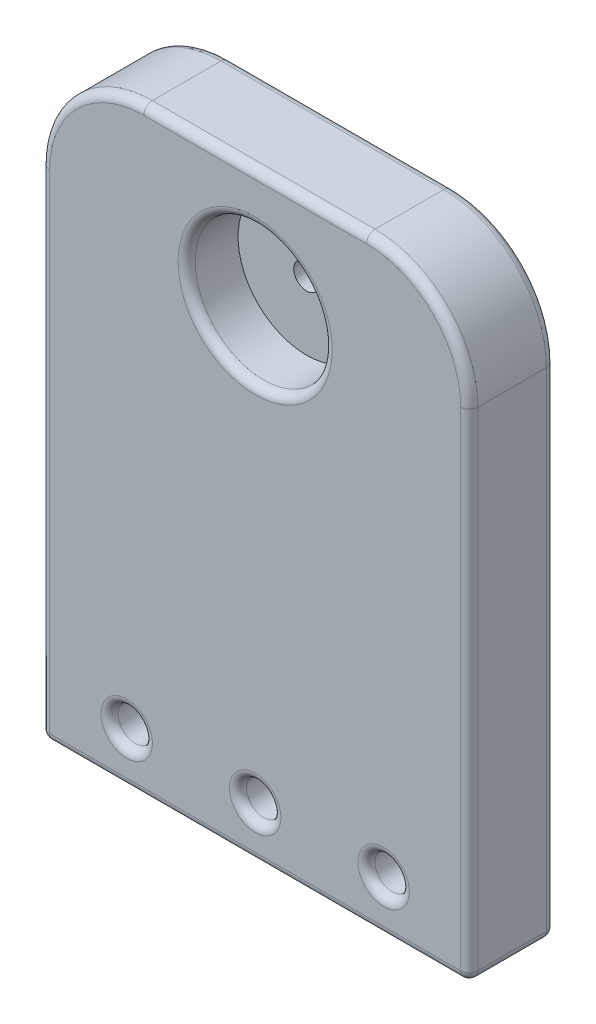
ISO-10303-21;
HEADER;
FILE_DESCRIPTION(('STEP AP214'),'2;1');
FILE_NAME('part.step','',(''),(''),'','','');
FILE_SCHEMA(('AUTOMOTIVE_DESIGN { 1 0 10303 214 1 1 1 1 }'));
ENDSEC;
DATA;
#1=APPLICATION_CONTEXT('core data for automotive mechanical design processes');
#2=APPLICATION_PROTOCOL_DEFINITION('international standard','automotive_design',2000,#1);
#3=PRODUCT_CONTEXT('',#1,'mechanical');
#4=PRODUCT('Part','Part','',(#3));
#5=PRODUCT_RELATED_PRODUCT_CATEGORY('part','',(#4));
#6=PRODUCT_DEFINITION_FORMATION('','',#4);
#7=PRODUCT_DEFINITION_CONTEXT('part definition',#1,'design');
#8=PRODUCT_DEFINITION('design','',#6,#7);
#9=PRODUCT_DEFINITION_SHAPE('','',#8);
#10=(LENGTH_UNIT() NAMED_UNIT(*) SI_UNIT(.MILLI.,.METRE.));
#11=(NAMED_UNIT(*) PLANE_ANGLE_UNIT() SI_UNIT($,.RADIAN.));
#12=(NAMED_UNIT(*) SI_UNIT($,.STERADIAN.) SOLID_ANGLE_UNIT());
#13=UNCERTAINTY_MEASURE_WITH_UNIT(LENGTH_MEASURE(1.E-05),#10,'distance_accuracy_value','');
#14=(GEOMETRIC_REPRESENTATION_CONTEXT(3) GLOBAL_UNCERTAINTY_ASSIGNED_CONTEXT((#13)) GLOBAL_UNIT_ASSIGNED_CONTEXT((#10,
#11,#12)) REPRESENTATION_CONTEXT('',''));
#15=CARTESIAN_POINT('',(0.,0.,0.));
#16=DIRECTION('',(0.,0.,1.));
#17=DIRECTION('',(1.,0.,0.));
#18=AXIS2_PLACEMENT_3D('',#15,#16,#17);
#19=CARTESIAN_POINT('',(-15.,-29.,14.));
#20=DIRECTION('',(0.,0.,-1.));
#21=DIRECTION('',(-1.,0.,0.));
#22=AXIS2_PLACEMENT_3D('',#19,#20,#21);
#23=CYLINDRICAL_SURFACE('',#22,2.);
#24=CARTESIAN_POINT('',(-15.,-29.,9.));
#25=DIRECTION('',(0.,0.,-1.));
#26=DIRECTION('',(-1.,0.,0.));
#27=AXIS2_PLACEMENT_3D('',#24,#25,#26);
#28=CIRCLE('',#27,2.);
#29=CARTESIAN_POINT('',(-17.,-29.,9.));
#30=VERTEX_POINT('',#29);
#31=EDGE_CURVE('E366',#30,#30,#28,.F.);
#32=ORIENTED_EDGE('',*,*,#31,.T.);
#33=EDGE_LOOP('',(#32));
#34=FACE_BOUND('',#33,.T.);
#35=CARTESIAN_POINT('',(-15.,-29.,4.));
#36=DIRECTION('',(0.,0.,-1.));
#37=DIRECTION('',(-1.,0.,0.));
#38=AXIS2_PLACEMENT_3D('',#35,#36,#37);
#39=CIRCLE('',#38,2.);
#40=CARTESIAN_POINT('',(-17.,-29.,4.));
#41=VERTEX_POINT('',#40);
#42=EDGE_CURVE('E263',#41,#41,#39,.F.);
#43=ORIENTED_EDGE('',*,*,#42,.F.);
#44=EDGE_LOOP('',(#43));
#45=FACE_BOUND('',#44,.T.);
#46=ADVANCED_FACE('F44',(#34,#45),#23,.F.);
#47=CARTESIAN_POINT('',(0.,-29.,14.));
#48=DIRECTION('',(0.,0.,-1.));
#49=DIRECTION('',(-1.,0.,0.));
#50=AXIS2_PLACEMENT_3D('',#47,#48,#49);
#51=CYLINDRICAL_SURFACE('',#50,2.);
#52=CARTESIAN_POINT('',(0.,-29.,9.));
#53=DIRECTION('',(0.,0.,-1.));
#54=DIRECTION('',(-1.,0.,0.));
#55=AXIS2_PLACEMENT_3D('',#52,#53,#54);
#56=CIRCLE('',#55,2.);
#57=CARTESIAN_POINT('',(-2.,-29.,9.));
#58=VERTEX_POINT('',#57);
#59=EDGE_CURVE('E370',#58,#58,#56,.F.);
#60=ORIENTED_EDGE('',*,*,#59,.T.);
#61=EDGE_LOOP('',(#60));
#62=FACE_BOUND('',#61,.T.);
#63=CARTESIAN_POINT('',(0.,-29.,4.));
#64=DIRECTION('',(0.,0.,-1.));
#65=DIRECTION('',(-1.,0.,0.));
#66=AXIS2_PLACEMENT_3D('',#63,#64,#65);
#67=CIRCLE('',#66,2.);
#68=CARTESIAN_POINT('',(-2.,-29.,4.));
#69=VERTEX_POINT('',#68);
#70=EDGE_CURVE('E280',#69,#69,#67,.F.);
#71=ORIENTED_EDGE('',*,*,#70,.F.);
#72=EDGE_LOOP('',(#71));
#73=FACE_BOUND('',#72,.T.);
#74=ADVANCED_FACE('F524',(#62,#73),#51,.F.);
#75=CARTESIAN_POINT('',(15.,-29.,14.));
#76=DIRECTION('',(0.,0.,-1.));
#77=DIRECTION('',(-1.,0.,0.));
#78=AXIS2_PLACEMENT_3D('',#75,#76,#77);
#79=CYLINDRICAL_SURFACE('',#78,2.);
#80=CARTESIAN_POINT('',(15.,-29.,9.));
#81=DIRECTION('',(0.,0.,-1.));
#82=DIRECTION('',(-1.,0.,0.));
#83=AXIS2_PLACEMENT_3D('',#80,#81,#82);
#84=CIRCLE('',#83,2.);
#85=CARTESIAN_POINT('',(13.,-29.,9.));
#86=VERTEX_POINT('',#85);
#87=EDGE_CURVE('E374',#86,#86,#84,.F.);
#88=ORIENTED_EDGE('',*,*,#87,.T.);
#89=EDGE_LOOP('',(#88));
#90=FACE_BOUND('',#89,.T.);
#91=CARTESIAN_POINT('',(15.,-29.,4.));
#92=DIRECTION('',(0.,0.,-1.));
#93=DIRECTION('',(-1.,0.,0.));
#94=AXIS2_PLACEMENT_3D('',#91,#92,#93);
#95=CIRCLE('',#94,2.);
#96=CARTESIAN_POINT('',(13.,-29.,4.));
#97=VERTEX_POINT('',#96);
#98=EDGE_CURVE('E276',#97,#97,#95,.F.);
#99=ORIENTED_EDGE('',*,*,#98,.F.);
#100=EDGE_LOOP('',(#99));
#101=FACE_BOUND('',#100,.T.);
#102=ADVANCED_FACE('F519',(#90,#101),#79,.F.);
#103=CARTESIAN_POINT('',(0.,21.25,10.));
#104=DIRECTION('',(0.,0.,-1.));
#105=DIRECTION('',(-1.,0.,0.));
#106=AXIS2_PLACEMENT_3D('',#103,#104,#105);
#107=CYLINDRICAL_SURFACE('',#106,1.5);
#108=CARTESIAN_POINT('',(0.,21.25,0.999999999999999));
#109=DIRECTION('',(0.,0.,-1.));
#110=DIRECTION('',(-1.,0.,0.));
#111=AXIS2_PLACEMENT_3D('',#108,#109,#110);
#112=CIRCLE('',#111,1.5);
#113=CARTESIAN_POINT('',(-1.50000000000001,21.25,0.999999999999999));
#114=VERTEX_POINT('',#113);
#115=EDGE_CURVE('E409',#114,#114,#112,.T.);
#116=ORIENTED_EDGE('',*,*,#115,.T.);
#117=EDGE_LOOP('',(#116));
#118=FACE_BOUND('',#117,.T.);
#119=CARTESIAN_POINT('',(0.,21.25,4.));
#120=DIRECTION('',(0.,0.,1.));
#121=DIRECTION('',(1.,0.,0.));
#122=AXIS2_PLACEMENT_3D('',#119,#120,#121);
#123=CIRCLE('',#122,1.5);
#124=CARTESIAN_POINT('',(1.5,21.25,4.));
#125=VERTEX_POINT('',#124);
#126=EDGE_CURVE('E262',#125,#125,#123,.F.);
#127=ORIENTED_EDGE('',*,*,#126,.F.);
#128=EDGE_LOOP('',(#127));
#129=FACE_BOUND('',#128,.T.);
#130=ADVANCED_FACE('F512',(#118,#129),#107,.F.);
#131=CARTESIAN_POINT('',(-25.,35.,10.));
#132=DIRECTION('',(1.,0.,0.));
#133=DIRECTION('',(0.,1.,0.));
#134=AXIS2_PLACEMENT_3D('',#131,#132,#133);
#135=PLANE('',#134);
#136=DIRECTION('',(0.,0.,-1.));
#137=VECTOR('',#136,1.);
#138=CARTESIAN_POINT('',(-25.,-34.,10.));
#139=LINE('',#138,#137);
#140=CARTESIAN_POINT('',(-25.,-34.,0.999999999999999));
#141=VERTEX_POINT('',#140);
#142=CARTESIAN_POINT('',(-25.,-34.,9.));
#143=VERTEX_POINT('',#142);
#144=EDGE_CURVE('E308',#141,#143,#139,.F.);
#145=ORIENTED_EDGE('',*,*,#144,.T.);
#146=DIRECTION('',(0.,-1.,0.));
#147=VECTOR('',#146,1.);
#148=CARTESIAN_POINT('',(-25.,35.,9.));
#149=LINE('',#148,#147);
#150=CARTESIAN_POINT('',(-25.,23.,9.));
#151=VERTEX_POINT('',#150);
#152=EDGE_CURVE('E311',#143,#151,#149,.F.);
#153=ORIENTED_EDGE('',*,*,#152,.T.);
#154=DIRECTION('',(0.,0.,-1.));
#155=VECTOR('',#154,1.);
#156=CARTESIAN_POINT('',(-25.,23.,10.));
#157=LINE('',#156,#155);
#158=CARTESIAN_POINT('',(-25.,23.,0.999999999999999));
#159=VERTEX_POINT('',#158);
#160=EDGE_CURVE('E159',#151,#159,#157,.T.);
#161=ORIENTED_EDGE('',*,*,#160,.T.);
#162=DIRECTION('',(0.,-1.,0.));
#163=VECTOR('',#162,1.);
#164=CARTESIAN_POINT('',(-25.,-35.,0.999999999999999));
#165=LINE('',#164,#163);
#166=EDGE_CURVE('E305',#159,#141,#165,.T.);
#167=ORIENTED_EDGE('',*,*,#166,.T.);
#168=EDGE_LOOP('',(#145,#153,#161,#167));
#169=FACE_BOUND('',#168,.T.);
#170=ADVANCED_FACE('F510',(#169),#135,.F.);
#171=CARTESIAN_POINT('',(25.,-35.,10.));
#172=DIRECTION('',(0.,1.,0.));
#173=DIRECTION('',(-1.,0.,0.));
#174=AXIS2_PLACEMENT_3D('',#171,#172,#173);
#175=PLANE('',#174);
#176=DIRECTION('',(0.,0.,-1.));
#177=VECTOR('',#176,1.);
#178=CARTESIAN_POINT('',(24.,-35.,10.));
#179=LINE('',#178,#177);
#180=CARTESIAN_POINT('',(24.,-35.,0.999999999999999));
#181=VERTEX_POINT('',#180);
#182=CARTESIAN_POINT('',(24.,-35.,9.));
#183=VERTEX_POINT('',#182);
#184=EDGE_CURVE('E298',#181,#183,#179,.F.);
#185=ORIENTED_EDGE('',*,*,#184,.T.);
#186=DIRECTION('',(1.,0.,0.));
#187=VECTOR('',#186,1.);
#188=CARTESIAN_POINT('',(25.,-35.,9.));
#189=LINE('',#188,#187);
#190=CARTESIAN_POINT('',(-24.,-35.,9.));
#191=VERTEX_POINT('',#190);
#192=EDGE_CURVE('E302',#183,#191,#189,.F.);
#193=ORIENTED_EDGE('',*,*,#192,.T.);
#194=DIRECTION('',(0.,0.,-1.));
#195=VECTOR('',#194,1.);
#196=CARTESIAN_POINT('',(-24.,-35.,10.));
#197=LINE('',#196,#195);
#198=CARTESIAN_POINT('',(-24.,-35.,0.999999999999999));
#199=VERTEX_POINT('',#198);
#200=EDGE_CURVE('E295',#191,#199,#197,.T.);
#201=ORIENTED_EDGE('',*,*,#200,.T.);
#202=DIRECTION('',(1.,0.,0.));
#203=VECTOR('',#202,1.);
#204=CARTESIAN_POINT('',(25.,-35.,0.999999999999999));
#205=LINE('',#204,#203);
#206=EDGE_CURVE('E292',#199,#181,#205,.T.);
#207=ORIENTED_EDGE('',*,*,#206,.T.);
#208=EDGE_LOOP('',(#185,#193,#201,#207));
#209=FACE_BOUND('',#208,.T.);
#210=ADVANCED_FACE('F452',(#209),#175,.F.);
#211=CARTESIAN_POINT('',(25.,35.,10.));
#212=DIRECTION('',(-1.,0.,0.));
#213=DIRECTION('',(0.,-1.,0.));
#214=AXIS2_PLACEMENT_3D('',#211,#212,#213);
#215=PLANE('',#214);
#216=DIRECTION('',(0.,0.,-1.));
#217=VECTOR('',#216,1.);
#218=CARTESIAN_POINT('',(25.,23.,10.));
#219=LINE('',#218,#217);
#220=CARTESIAN_POINT('',(25.,23.,0.999999999999999));
#221=VERTEX_POINT('',#220);
#222=CARTESIAN_POINT('',(25.,23.,9.));
#223=VERTEX_POINT('',#222);
#224=EDGE_CURVE('E151',#221,#223,#219,.F.);
#225=ORIENTED_EDGE('',*,*,#224,.T.);
#226=DIRECTION('',(0.,1.,0.));
#227=VECTOR('',#226,1.);
#228=CARTESIAN_POINT('',(25.,35.,9.));
#229=LINE('',#228,#227);
#230=CARTESIAN_POINT('',(25.,-34.,9.));
#231=VERTEX_POINT('',#230);
#232=EDGE_CURVE('E289',#223,#231,#229,.F.);
#233=ORIENTED_EDGE('',*,*,#232,.T.);
#234=DIRECTION('',(0.,0.,-1.));
#235=VECTOR('',#234,1.);
#236=CARTESIAN_POINT('',(25.,-34.,10.));
#237=LINE('',#236,#235);
#238=CARTESIAN_POINT('',(25.,-34.,0.999999999999999));
#239=VERTEX_POINT('',#238);
#240=EDGE_CURVE('E154',#231,#239,#237,.T.);
#241=ORIENTED_EDGE('',*,*,#240,.T.);
#242=DIRECTION('',(0.,1.,0.));
#243=VECTOR('',#242,1.);
#244=CARTESIAN_POINT('',(25.,23.,0.999999999999999));
#245=LINE('',#244,#243);
#246=EDGE_CURVE('E148',#239,#221,#245,.T.);
#247=ORIENTED_EDGE('',*,*,#246,.T.);
#248=EDGE_LOOP('',(#225,#233,#241,#247));
#249=FACE_BOUND('',#248,.T.);
#250=ADVANCED_FACE('F150',(#249),#215,.F.);
#251=CARTESIAN_POINT('',(25.,35.,10.));
#252=DIRECTION('',(0.,-1.,0.));
#253=DIRECTION('',(1.,0.,0.));
#254=AXIS2_PLACEMENT_3D('',#251,#252,#253);
#255=PLANE('',#254);
#256=DIRECTION('',(0.,0.,-1.));
#257=VECTOR('',#256,1.);
#258=CARTESIAN_POINT('',(-13.,35.,10.));
#259=LINE('',#258,#257);
#260=CARTESIAN_POINT('',(-13.,35.,0.999999999999999));
#261=VERTEX_POINT('',#260);
#262=CARTESIAN_POINT('',(-13.,35.,9.));
#263=VERTEX_POINT('',#262);
#264=EDGE_CURVE('E267',#261,#263,#259,.F.);
#265=ORIENTED_EDGE('',*,*,#264,.T.);
#266=DIRECTION('',(-1.,0.,0.));
#267=VECTOR('',#266,1.);
#268=CARTESIAN_POINT('',(25.,35.,9.));
#269=LINE('',#268,#267);
#270=CARTESIAN_POINT('',(13.,35.,9.));
#271=VERTEX_POINT('',#270);
#272=EDGE_CURVE('E182',#263,#271,#269,.F.);
#273=ORIENTED_EDGE('',*,*,#272,.T.);
#274=DIRECTION('',(0.,0.,-1.));
#275=VECTOR('',#274,1.);
#276=CARTESIAN_POINT('',(13.,35.,10.));
#277=LINE('',#276,#275);
#278=CARTESIAN_POINT('',(13.,35.,0.999999999999999));
#279=VERTEX_POINT('',#278);
#280=EDGE_CURVE('E170',#271,#279,#277,.T.);
#281=ORIENTED_EDGE('',*,*,#280,.T.);
#282=DIRECTION('',(-1.,0.,0.));
#283=VECTOR('',#282,1.);
#284=CARTESIAN_POINT('',(-13.,35.,0.999999999999999));
#285=LINE('',#284,#283);
#286=EDGE_CURVE('E355',#279,#261,#285,.T.);
#287=ORIENTED_EDGE('',*,*,#286,.T.);
#288=EDGE_LOOP('',(#265,#273,#281,#287));
#289=FACE_BOUND('',#288,.T.);
#290=ADVANCED_FACE('F482',(#289),#255,.F.);
#291=CARTESIAN_POINT('',(0.,0.,10.));
#292=DIRECTION('',(0.,0.,-1.));
#293=DIRECTION('',(-1.,0.,0.));
#294=AXIS2_PLACEMENT_3D('',#291,#292,#293);
#295=PLANE('',#294);
#296=DIRECTION('',(0.,-1.,0.));
#297=VECTOR('',#296,1.);
#298=CARTESIAN_POINT('',(-24.,0.,10.));
#299=LINE('',#298,#297);
#300=CARTESIAN_POINT('',(-24.,23.,10.));
#301=VERTEX_POINT('',#300);
#302=CARTESIAN_POINT('',(-24.,-34.,10.));
#303=VERTEX_POINT('',#302);
#304=EDGE_CURVE('E342',#301,#303,#299,.T.);
#305=ORIENTED_EDGE('',*,*,#304,.T.);
#306=DIRECTION('',(1.,0.,0.));
#307=VECTOR('',#306,1.);
#308=CARTESIAN_POINT('',(0.,-34.,10.));
#309=LINE('',#308,#307);
#310=CARTESIAN_POINT('',(24.,-34.,10.));
#311=VERTEX_POINT('',#310);
#312=EDGE_CURVE('E345',#303,#311,#309,.T.);
#313=ORIENTED_EDGE('',*,*,#312,.T.);
#314=DIRECTION('',(0.,1.,0.));
#315=VECTOR('',#314,1.);
#316=CARTESIAN_POINT('',(24.,0.,10.));
#317=LINE('',#316,#315);
#318=CARTESIAN_POINT('',(24.,23.,10.));
#319=VERTEX_POINT('',#318);
#320=EDGE_CURVE('E330',#311,#319,#317,.T.);
#321=ORIENTED_EDGE('',*,*,#320,.T.);
#322=CARTESIAN_POINT('',(13.,23.,10.));
#323=DIRECTION('',(0.,0.,-1.));
#324=DIRECTION('',(-1.,0.,0.));
#325=AXIS2_PLACEMENT_3D('',#322,#323,#324);
#326=CIRCLE('',#325,11.);
#327=CARTESIAN_POINT('',(13.,34.,10.));
#328=VERTEX_POINT('',#327);
#329=EDGE_CURVE('E333',#319,#328,#326,.F.);
#330=ORIENTED_EDGE('',*,*,#329,.T.);
#331=DIRECTION('',(-1.,0.,0.));
#332=VECTOR('',#331,1.);
#333=CARTESIAN_POINT('',(0.,34.,10.));
#334=LINE('',#333,#332);
#335=CARTESIAN_POINT('',(-13.,34.,10.));
#336=VERTEX_POINT('',#335);
#337=EDGE_CURVE('E336',#328,#336,#334,.T.);
#338=ORIENTED_EDGE('',*,*,#337,.T.);
#339=CARTESIAN_POINT('',(-13.,23.,10.));
#340=DIRECTION('',(0.,0.,-1.));
#341=DIRECTION('',(-1.,0.,0.));
#342=AXIS2_PLACEMENT_3D('',#339,#340,#341);
#343=CIRCLE('',#342,11.);
#344=EDGE_CURVE('E339',#336,#301,#343,.F.);
#345=ORIENTED_EDGE('',*,*,#344,.T.);
#346=EDGE_LOOP('',(#305,#313,#321,#330,#338,#345));
#347=FACE_BOUND('',#346,.T.);
#348=CARTESIAN_POINT('',(0.,21.25,10.));
#349=DIRECTION('',(0.,0.,-1.));
#350=DIRECTION('',(-1.,0.,0.));
#351=AXIS2_PLACEMENT_3D('',#348,#349,#350);
#352=CIRCLE('',#351,9.);
#353=CARTESIAN_POINT('',(-9.00000000000001,21.25,10.));
#354=VERTEX_POINT('',#353);
#355=EDGE_CURVE('E326',#354,#354,#352,.T.);
#356=ORIENTED_EDGE('',*,*,#355,.T.);
#357=EDGE_LOOP('',(#356));
#358=FACE_BOUND('',#357,.T.);
#359=CARTESIAN_POINT('',(-15.,-29.,10.));
#360=DIRECTION('',(0.,0.,-1.));
#361=DIRECTION('',(-1.,0.,0.));
#362=AXIS2_PLACEMENT_3D('',#359,#360,#361);
#363=CIRCLE('',#362,3.);
#364=CARTESIAN_POINT('',(-18.,-29.,10.));
#365=VERTEX_POINT('',#364);
#366=EDGE_CURVE('E322',#365,#365,#363,.T.);
#367=ORIENTED_EDGE('',*,*,#366,.T.);
#368=EDGE_LOOP('',(#367));
#369=FACE_BOUND('',#368,.T.);
#370=CARTESIAN_POINT('',(0.,-29.,10.));
#371=DIRECTION('',(0.,0.,-1.));
#372=DIRECTION('',(-1.,0.,0.));
#373=AXIS2_PLACEMENT_3D('',#370,#371,#372);
#374=CIRCLE('',#373,3.);
#375=CARTESIAN_POINT('',(-3.,-29.,10.));
#376=VERTEX_POINT('',#375);
#377=EDGE_CURVE('E318',#376,#376,#374,.T.);
#378=ORIENTED_EDGE('',*,*,#377,.T.);
#379=EDGE_LOOP('',(#378));
#380=FACE_BOUND('',#379,.T.);
#381=CARTESIAN_POINT('',(15.,-29.,10.));
#382=DIRECTION('',(0.,0.,-1.));
#383=DIRECTION('',(-1.,0.,0.));
#384=AXIS2_PLACEMENT_3D('',#381,#382,#383);
#385=CIRCLE('',#384,3.);
#386=CARTESIAN_POINT('',(12.,-29.,10.));
#387=VERTEX_POINT('',#386);
#388=EDGE_CURVE('E314',#387,#387,#385,.T.);
#389=ORIENTED_EDGE('',*,*,#388,.T.);
#390=EDGE_LOOP('',(#389));
#391=FACE_BOUND('',#390,.T.);
#392=ADVANCED_FACE('F499',(#347,#358,#369,#380,#391),#295,.F.);
#393=CARTESIAN_POINT('',(0.,0.,0.));
#394=DIRECTION('',(0.,0.,-1.));
#395=DIRECTION('',(-1.,0.,0.));
#396=AXIS2_PLACEMENT_3D('',#393,#394,#395);
#397=PLANE('',#396);
#398=DIRECTION('',(0.,-1.,0.));
#399=VECTOR('',#398,1.);
#400=CARTESIAN_POINT('',(-24.,23.,0.));
#401=LINE('',#400,#399);
#402=CARTESIAN_POINT('',(-24.,-34.,0.));
#403=VERTEX_POINT('',#402);
#404=CARTESIAN_POINT('',(-24.,23.,0.));
#405=VERTEX_POINT('',#404);
#406=EDGE_CURVE('E62',#403,#405,#401,.F.);
#407=ORIENTED_EDGE('',*,*,#406,.T.);
#408=CARTESIAN_POINT('',(-13.,23.,0.));
#409=DIRECTION('',(0.,0.,-1.));
#410=DIRECTION('',(-1.,0.,0.));
#411=AXIS2_PLACEMENT_3D('',#408,#409,#410);
#412=CIRCLE('',#411,11.);
#413=CARTESIAN_POINT('',(-13.,34.,0.));
#414=VERTEX_POINT('',#413);
#415=EDGE_CURVE('E406',#405,#414,#412,.T.);
#416=ORIENTED_EDGE('',*,*,#415,.T.);
#417=DIRECTION('',(-1.,0.,0.));
#418=VECTOR('',#417,1.);
#419=CARTESIAN_POINT('',(13.,34.,0.));
#420=LINE('',#419,#418);
#421=CARTESIAN_POINT('',(13.,34.,0.));
#422=VERTEX_POINT('',#421);
#423=EDGE_CURVE('E394',#414,#422,#420,.F.);
#424=ORIENTED_EDGE('',*,*,#423,.T.);
#425=CARTESIAN_POINT('',(13.,23.,0.));
#426=DIRECTION('',(0.,0.,-1.));
#427=DIRECTION('',(-1.,0.,0.));
#428=AXIS2_PLACEMENT_3D('',#425,#426,#427);
#429=CIRCLE('',#428,11.);
#430=CARTESIAN_POINT('',(24.,23.,0.));
#431=VERTEX_POINT('',#430);
#432=EDGE_CURVE('E397',#422,#431,#429,.T.);
#433=ORIENTED_EDGE('',*,*,#432,.T.);
#434=DIRECTION('',(0.,1.,0.));
#435=VECTOR('',#434,1.);
#436=CARTESIAN_POINT('',(24.,-35.,0.));
#437=LINE('',#436,#435);
#438=CARTESIAN_POINT('',(24.,-34.,0.));
#439=VERTEX_POINT('',#438);
#440=EDGE_CURVE('E185',#431,#439,#437,.F.);
#441=ORIENTED_EDGE('',*,*,#440,.T.);
#442=DIRECTION('',(1.,0.,0.));
#443=VECTOR('',#442,1.);
#444=CARTESIAN_POINT('',(-25.,-34.,0.));
#445=LINE('',#444,#443);
#446=EDGE_CURVE('E67',#439,#403,#445,.F.);
#447=ORIENTED_EDGE('',*,*,#446,.T.);
#448=EDGE_LOOP('',(#407,#416,#424,#433,#441,#447));
#449=FACE_BOUND('',#448,.T.);
#450=CARTESIAN_POINT('',(0.,21.25,0.));
#451=DIRECTION('',(0.,0.,-1.));
#452=DIRECTION('',(-1.,0.,0.));
#453=AXIS2_PLACEMENT_3D('',#450,#451,#452);
#454=CIRCLE('',#453,2.5);
#455=CARTESIAN_POINT('',(-2.5,21.25,0.));
#456=VERTEX_POINT('',#455);
#457=EDGE_CURVE('E390',#456,#456,#454,.F.);
#458=ORIENTED_EDGE('',*,*,#457,.T.);
#459=EDGE_LOOP('',(#458));
#460=FACE_BOUND('',#459,.T.);
#461=CARTESIAN_POINT('',(-15.,-29.,0.));
#462=DIRECTION('',(0.,0.,-1.));
#463=DIRECTION('',(-1.,0.,0.));
#464=AXIS2_PLACEMENT_3D('',#461,#462,#463);
#465=CIRCLE('',#464,4.875);
#466=CARTESIAN_POINT('',(-19.875,-29.,0.));
#467=VERTEX_POINT('',#466);
#468=EDGE_CURVE('E386',#467,#467,#465,.F.);
#469=ORIENTED_EDGE('',*,*,#468,.T.);
#470=EDGE_LOOP('',(#469));
#471=FACE_BOUND('',#470,.T.);
#472=CARTESIAN_POINT('',(0.,-29.,0.));
#473=DIRECTION('',(0.,0.,-1.));
#474=DIRECTION('',(-1.,0.,0.));
#475=AXIS2_PLACEMENT_3D('',#472,#473,#474);
#476=CIRCLE('',#475,4.875);
#477=CARTESIAN_POINT('',(-4.875,-29.,0.));
#478=VERTEX_POINT('',#477);
#479=EDGE_CURVE('E382',#478,#478,#476,.F.);
#480=ORIENTED_EDGE('',*,*,#479,.T.);
#481=EDGE_LOOP('',(#480));
#482=FACE_BOUND('',#481,.T.);
#483=CARTESIAN_POINT('',(15.,-29.,0.));
#484=DIRECTION('',(0.,0.,-1.));
#485=DIRECTION('',(-1.,0.,0.));
#486=AXIS2_PLACEMENT_3D('',#483,#484,#485);
#487=CIRCLE('',#486,4.875);
#488=CARTESIAN_POINT('',(10.125,-29.,0.));
#489=VERTEX_POINT('',#488);
#490=EDGE_CURVE('E378',#489,#489,#487,.F.);
#491=ORIENTED_EDGE('',*,*,#490,.T.);
#492=EDGE_LOOP('',(#491));
#493=FACE_BOUND('',#492,.T.);
#494=ADVANCED_FACE('F475',(#449,#460,#471,#482,#493),#397,.T.);
#495=CARTESIAN_POINT('',(0.,21.25,4.));
#496=DIRECTION('',(0.,0.,1.));
#497=DIRECTION('',(1.,0.,0.));
#498=AXIS2_PLACEMENT_3D('',#495,#496,#497);
#499=PLANE('',#498);
#500=CARTESIAN_POINT('',(0.,21.25,4.));
#501=DIRECTION('',(0.,0.,1.));
#502=DIRECTION('',(1.,0.,0.));
#503=AXIS2_PLACEMENT_3D('',#500,#501,#502);
#504=CIRCLE('',#503,8.);
#505=CARTESIAN_POINT('',(8.,21.25,4.));
#506=VERTEX_POINT('',#505);
#507=EDGE_CURVE('E258',#506,#506,#504,.T.);
#508=ORIENTED_EDGE('',*,*,#507,.T.);
#509=EDGE_LOOP('',(#508));
#510=FACE_BOUND('',#509,.T.);
#511=ORIENTED_EDGE('',*,*,#126,.T.);
#512=EDGE_LOOP('',(#511));
#513=FACE_BOUND('',#512,.T.);
#514=ADVANCED_FACE('F535',(#510,#513),#499,.T.);
#515=CARTESIAN_POINT('',(0.,21.25,4.));
#516=DIRECTION('',(0.,0.,1.));
#517=DIRECTION('',(1.,0.,0.));
#518=AXIS2_PLACEMENT_3D('',#515,#516,#517);
#519=CYLINDRICAL_SURFACE('',#518,8.);
#520=CARTESIAN_POINT('',(0.,21.25,9.));
#521=DIRECTION('',(0.,0.,-1.));
#522=DIRECTION('',(-1.,0.,0.));
#523=AXIS2_PLACEMENT_3D('',#520,#521,#522);
#524=CIRCLE('',#523,8.);
#525=CARTESIAN_POINT('',(-8.,21.25,9.));
#526=VERTEX_POINT('',#525);
#527=EDGE_CURVE('E362',#526,#526,#524,.F.);
#528=ORIENTED_EDGE('',*,*,#527,.T.);
#529=EDGE_LOOP('',(#528));
#530=FACE_BOUND('',#529,.T.);
#531=ORIENTED_EDGE('',*,*,#507,.F.);
#532=EDGE_LOOP('',(#531));
#533=FACE_BOUND('',#532,.T.);
#534=ADVANCED_FACE('F538',(#530,#533),#519,.F.);
#535=CARTESIAN_POINT('',(13.,23.,10.));
#536=DIRECTION('',(0.,0.,-1.));
#537=DIRECTION('',(-1.,0.,0.));
#538=AXIS2_PLACEMENT_3D('',#535,#536,#537);
#539=CYLINDRICAL_SURFACE('',#538,12.);
#540=ORIENTED_EDGE('',*,*,#280,.F.);
#541=CARTESIAN_POINT('',(13.,23.,9.));
#542=DIRECTION('',(0.,0.,-1.));
#543=DIRECTION('',(-1.,0.,0.));
#544=AXIS2_PLACEMENT_3D('',#541,#542,#543);
#545=CIRCLE('',#544,12.);
#546=EDGE_CURVE('E168',#271,#223,#545,.T.);
#547=ORIENTED_EDGE('',*,*,#546,.T.);
#548=ORIENTED_EDGE('',*,*,#224,.F.);
#549=CARTESIAN_POINT('',(13.,23.,0.999999999999999));
#550=DIRECTION('',(0.,0.,-1.));
#551=DIRECTION('',(-1.,0.,0.));
#552=AXIS2_PLACEMENT_3D('',#549,#550,#551);
#553=CIRCLE('',#552,12.);
#554=EDGE_CURVE('E165',#221,#279,#553,.F.);
#555=ORIENTED_EDGE('',*,*,#554,.T.);
#556=EDGE_LOOP('',(#540,#547,#548,#555));
#557=FACE_BOUND('',#556,.T.);
#558=ADVANCED_FACE('F164',(#557),#539,.T.);
#559=CARTESIAN_POINT('',(-13.,23.,10.));
#560=DIRECTION('',(0.,0.,-1.));
#561=DIRECTION('',(-1.,0.,0.));
#562=AXIS2_PLACEMENT_3D('',#559,#560,#561);
#563=CYLINDRICAL_SURFACE('',#562,12.);
#564=ORIENTED_EDGE('',*,*,#160,.F.);
#565=CARTESIAN_POINT('',(-13.,23.,9.));
#566=DIRECTION('',(0.,0.,-1.));
#567=DIRECTION('',(-1.,0.,0.));
#568=AXIS2_PLACEMENT_3D('',#565,#566,#567);
#569=CIRCLE('',#568,12.);
#570=EDGE_CURVE('E352',#151,#263,#569,.T.);
#571=ORIENTED_EDGE('',*,*,#570,.T.);
#572=ORIENTED_EDGE('',*,*,#264,.F.);
#573=CARTESIAN_POINT('',(-13.,23.,0.999999999999999));
#574=DIRECTION('',(0.,0.,-1.));
#575=DIRECTION('',(-1.,0.,0.));
#576=AXIS2_PLACEMENT_3D('',#573,#574,#575);
#577=CIRCLE('',#576,12.);
#578=EDGE_CURVE('E349',#261,#159,#577,.F.);
#579=ORIENTED_EDGE('',*,*,#578,.T.);
#580=EDGE_LOOP('',(#564,#571,#572,#579));
#581=FACE_BOUND('',#580,.T.);
#582=ADVANCED_FACE('F485',(#581),#563,.T.);
#583=CARTESIAN_POINT('',(15.,-29.,4.));
#584=DIRECTION('',(0.,0.,-1.));
#585=DIRECTION('',(-1.,0.,0.));
#586=AXIS2_PLACEMENT_3D('',#583,#584,#585);
#587=PLANE('',#586);
#588=CARTESIAN_POINT('',(15.,-29.,4.));
#589=DIRECTION('',(0.,0.,-1.));
#590=DIRECTION('',(-1.,0.,0.));
#591=AXIS2_PLACEMENT_3D('',#588,#589,#590);
#592=CIRCLE('',#591,3.875);
#593=CARTESIAN_POINT('',(11.125,-29.,4.));
#594=VERTEX_POINT('',#593);
#595=EDGE_CURVE('E254',#594,#594,#592,.T.);
#596=ORIENTED_EDGE('',*,*,#595,.T.);
#597=EDGE_LOOP('',(#596));
#598=FACE_BOUND('',#597,.T.);
#599=ORIENTED_EDGE('',*,*,#98,.T.);
#600=EDGE_LOOP('',(#599));
#601=FACE_BOUND('',#600,.T.);
#602=ADVANCED_FACE('F586',(#598,#601),#587,.T.);
#603=CARTESIAN_POINT('',(15.,-29.,4.));
#604=DIRECTION('',(0.,0.,-1.));
#605=DIRECTION('',(-1.,0.,0.));
#606=AXIS2_PLACEMENT_3D('',#603,#604,#605);
#607=CYLINDRICAL_SURFACE('',#606,3.875);
#608=CARTESIAN_POINT('',(15.,-29.,1.));
#609=DIRECTION('',(0.,0.,-1.));
#610=DIRECTION('',(-1.,0.,0.));
#611=AXIS2_PLACEMENT_3D('',#608,#609,#610);
#612=CIRCLE('',#611,3.875);
#613=CARTESIAN_POINT('',(11.125,-29.,1.));
#614=VERTEX_POINT('',#613);
#615=EDGE_CURVE('E11',#614,#614,#612,.T.);
#616=ORIENTED_EDGE('',*,*,#615,.T.);
#617=EDGE_LOOP('',(#616));
#618=FACE_BOUND('',#617,.T.);
#619=ORIENTED_EDGE('',*,*,#595,.F.);
#620=EDGE_LOOP('',(#619));
#621=FACE_BOUND('',#620,.T.);
#622=ADVANCED_FACE('F593',(#618,#621),#607,.F.);
#623=CARTESIAN_POINT('',(0.,-29.,4.));
#624=DIRECTION('',(0.,0.,-1.));
#625=DIRECTION('',(-1.,0.,0.));
#626=AXIS2_PLACEMENT_3D('',#623,#624,#625);
#627=PLANE('',#626);
#628=CARTESIAN_POINT('',(0.,-29.,4.));
#629=DIRECTION('',(0.,0.,-1.));
#630=DIRECTION('',(-1.,0.,0.));
#631=AXIS2_PLACEMENT_3D('',#628,#629,#630);
#632=CIRCLE('',#631,3.875);
#633=CARTESIAN_POINT('',(-3.875,-29.,4.));
#634=VERTEX_POINT('',#633);
#635=EDGE_CURVE('E248',#634,#634,#632,.T.);
#636=ORIENTED_EDGE('',*,*,#635,.T.);
#637=EDGE_LOOP('',(#636));
#638=FACE_BOUND('',#637,.T.);
#639=ORIENTED_EDGE('',*,*,#70,.T.);
#640=EDGE_LOOP('',(#639));
#641=FACE_BOUND('',#640,.T.);
#642=ADVANCED_FACE('F601',(#638,#641),#627,.T.);
#643=CARTESIAN_POINT('',(0.,-29.,4.));
#644=DIRECTION('',(0.,0.,-1.));
#645=DIRECTION('',(-1.,0.,0.));
#646=AXIS2_PLACEMENT_3D('',#643,#644,#645);
#647=CYLINDRICAL_SURFACE('',#646,3.875);
#648=CARTESIAN_POINT('',(0.,-29.,1.));
#649=DIRECTION('',(0.,0.,-1.));
#650=DIRECTION('',(-1.,0.,0.));
#651=AXIS2_PLACEMENT_3D('',#648,#649,#650);
#652=CIRCLE('',#651,3.875);
#653=CARTESIAN_POINT('',(-3.875,-29.,1.));
#654=VERTEX_POINT('',#653);
#655=EDGE_CURVE('E54',#654,#654,#652,.T.);
#656=ORIENTED_EDGE('',*,*,#655,.T.);
#657=EDGE_LOOP('',(#656));
#658=FACE_BOUND('',#657,.T.);
#659=ORIENTED_EDGE('',*,*,#635,.F.);
#660=EDGE_LOOP('',(#659));
#661=FACE_BOUND('',#660,.T.);
#662=ADVANCED_FACE('F609',(#658,#661),#647,.F.);
#663=CARTESIAN_POINT('',(-15.,-29.,4.));
#664=DIRECTION('',(0.,0.,-1.));
#665=DIRECTION('',(-1.,0.,0.));
#666=AXIS2_PLACEMENT_3D('',#663,#664,#665);
#667=PLANE('',#666);
#668=CARTESIAN_POINT('',(-15.,-29.,4.));
#669=DIRECTION('',(0.,0.,-1.));
#670=DIRECTION('',(-1.,0.,0.));
#671=AXIS2_PLACEMENT_3D('',#668,#669,#670);
#672=CIRCLE('',#671,3.875);
#673=CARTESIAN_POINT('',(-18.875,-29.,4.));
#674=VERTEX_POINT('',#673);
#675=EDGE_CURVE('E241',#674,#674,#672,.T.);
#676=ORIENTED_EDGE('',*,*,#675,.T.);
#677=EDGE_LOOP('',(#676));
#678=FACE_BOUND('',#677,.T.);
#679=ORIENTED_EDGE('',*,*,#42,.T.);
#680=EDGE_LOOP('',(#679));
#681=FACE_BOUND('',#680,.T.);
#682=ADVANCED_FACE('F617',(#678,#681),#667,.T.);
#683=CARTESIAN_POINT('',(-15.,-29.,4.));
#684=DIRECTION('',(0.,0.,-1.));
#685=DIRECTION('',(-1.,0.,0.));
#686=AXIS2_PLACEMENT_3D('',#683,#684,#685);
#687=CYLINDRICAL_SURFACE('',#686,3.875);
#688=CARTESIAN_POINT('',(-15.,-29.,1.));
#689=DIRECTION('',(0.,0.,-1.));
#690=DIRECTION('',(-1.,0.,0.));
#691=AXIS2_PLACEMENT_3D('',#688,#689,#690);
#692=CIRCLE('',#691,3.875);
#693=CARTESIAN_POINT('',(-18.875,-29.,1.));
#694=VERTEX_POINT('',#693);
#695=EDGE_CURVE('E413',#694,#694,#692,.T.);
#696=ORIENTED_EDGE('',*,*,#695,.T.);
#697=EDGE_LOOP('',(#696));
#698=FACE_BOUND('',#697,.T.);
#699=ORIENTED_EDGE('',*,*,#675,.F.);
#700=EDGE_LOOP('',(#699));
#701=FACE_BOUND('',#700,.T.);
#702=ADVANCED_FACE('F625',(#698,#701),#687,.F.);
#703=CARTESIAN_POINT('',(-13.,23.,9.));
#704=DIRECTION('',(0.,0.,-1.));
#705=DIRECTION('',(-1.,0.,0.));
#706=AXIS2_PLACEMENT_3D('',#703,#704,#705);
#707=TOROIDAL_SURFACE('',#706,11.,1.);
#708=CARTESIAN_POINT('',(-13.,34.,9.));
#709=DIRECTION('',(1.,0.,0.));
#710=DIRECTION('',(0.,0.,-1.));
#711=AXIS2_PLACEMENT_3D('',#708,#709,#710);
#712=CIRCLE('',#711,1.);
#713=EDGE_CURVE('E232',#263,#336,#712,.T.);
#714=ORIENTED_EDGE('',*,*,#713,.F.);
#715=ORIENTED_EDGE('',*,*,#570,.F.);
#716=CARTESIAN_POINT('',(-24.,23.,9.));
#717=DIRECTION('',(0.,-1.,0.));
#718=DIRECTION('',(0.,0.,-1.));
#719=AXIS2_PLACEMENT_3D('',#716,#717,#718);
#720=CIRCLE('',#719,1.);
#721=EDGE_CURVE('E48',#301,#151,#720,.T.);
#722=ORIENTED_EDGE('',*,*,#721,.F.);
#723=ORIENTED_EDGE('',*,*,#344,.F.);
#724=EDGE_LOOP('',(#714,#715,#722,#723));
#725=FACE_BOUND('',#724,.T.);
#726=ADVANCED_FACE('F488',(#725),#707,.T.);
#727=CARTESIAN_POINT('',(-13.,23.,0.999999999999999));
#728=DIRECTION('',(0.,0.,-1.));
#729=DIRECTION('',(-1.,0.,0.));
#730=AXIS2_PLACEMENT_3D('',#727,#728,#729);
#731=TOROIDAL_SURFACE('',#730,11.,1.);
#732=CARTESIAN_POINT('',(-24.,23.,0.999999999999999));
#733=DIRECTION('',(0.,-1.,0.));
#734=DIRECTION('',(0.,0.,-1.));
#735=AXIS2_PLACEMENT_3D('',#732,#733,#734);
#736=CIRCLE('',#735,1.);
#737=EDGE_CURVE('E225',#159,#405,#736,.T.);
#738=ORIENTED_EDGE('',*,*,#737,.F.);
#739=ORIENTED_EDGE('',*,*,#578,.F.);
#740=CARTESIAN_POINT('',(-13.,34.,1.));
#741=DIRECTION('',(1.,0.,0.));
#742=DIRECTION('',(0.,0.,-1.));
#743=AXIS2_PLACEMENT_3D('',#740,#741,#742);
#744=CIRCLE('',#743,1.);
#745=EDGE_CURVE('E229',#414,#261,#744,.T.);
#746=ORIENTED_EDGE('',*,*,#745,.F.);
#747=ORIENTED_EDGE('',*,*,#415,.F.);
#748=EDGE_LOOP('',(#738,#739,#746,#747));
#749=FACE_BOUND('',#748,.T.);
#750=ADVANCED_FACE('F473',(#749),#731,.T.);
#751=CARTESIAN_POINT('',(-24.,0.,9.));
#752=DIRECTION('',(0.,-1.,0.));
#753=DIRECTION('',(1.,0.,0.));
#754=AXIS2_PLACEMENT_3D('',#751,#752,#753);
#755=CYLINDRICAL_SURFACE('',#754,1.);
#756=ORIENTED_EDGE('',*,*,#721,.T.);
#757=ORIENTED_EDGE('',*,*,#152,.F.);
#758=CARTESIAN_POINT('',(-24.,-34.,9.));
#759=DIRECTION('',(0.,-1.,0.));
#760=DIRECTION('',(0.,0.,-1.));
#761=AXIS2_PLACEMENT_3D('',#758,#759,#760);
#762=CIRCLE('',#761,1.);
#763=EDGE_CURVE('E217',#303,#143,#762,.T.);
#764=ORIENTED_EDGE('',*,*,#763,.F.);
#765=ORIENTED_EDGE('',*,*,#304,.F.);
#766=EDGE_LOOP('',(#756,#757,#764,#765));
#767=FACE_BOUND('',#766,.T.);
#768=ADVANCED_FACE('F502',(#767),#755,.T.);
#769=CARTESIAN_POINT('',(0.,34.,9.));
#770=DIRECTION('',(-1.,0.,0.));
#771=DIRECTION('',(0.,-1.,0.));
#772=AXIS2_PLACEMENT_3D('',#769,#770,#771);
#773=CYLINDRICAL_SURFACE('',#772,1.);
#774=ORIENTED_EDGE('',*,*,#713,.T.);
#775=ORIENTED_EDGE('',*,*,#337,.F.);
#776=CARTESIAN_POINT('',(13.,34.,9.));
#777=DIRECTION('',(1.,0.,0.));
#778=DIRECTION('',(0.,0.,-1.));
#779=AXIS2_PLACEMENT_3D('',#776,#777,#778);
#780=CIRCLE('',#779,1.);
#781=EDGE_CURVE('E213',#271,#328,#780,.T.);
#782=ORIENTED_EDGE('',*,*,#781,.F.);
#783=ORIENTED_EDGE('',*,*,#272,.F.);
#784=EDGE_LOOP('',(#774,#775,#782,#783));
#785=FACE_BOUND('',#784,.T.);
#786=ADVANCED_FACE('F491',(#785),#773,.T.);
#787=CARTESIAN_POINT('',(25.,34.,0.999999999999999));
#788=DIRECTION('',(1.,0.,0.));
#789=DIRECTION('',(0.,1.,0.));
#790=AXIS2_PLACEMENT_3D('',#787,#788,#789);
#791=CYLINDRICAL_SURFACE('',#790,1.);
#792=ORIENTED_EDGE('',*,*,#745,.T.);
#793=ORIENTED_EDGE('',*,*,#286,.F.);
#794=CARTESIAN_POINT('',(13.,34.,1.));
#795=DIRECTION('',(1.,0.,0.));
#796=DIRECTION('',(0.,0.,-1.));
#797=AXIS2_PLACEMENT_3D('',#794,#795,#796);
#798=CIRCLE('',#797,1.);
#799=EDGE_CURVE('E180',#422,#279,#798,.T.);
#800=ORIENTED_EDGE('',*,*,#799,.F.);
#801=ORIENTED_EDGE('',*,*,#423,.F.);
#802=EDGE_LOOP('',(#792,#793,#800,#801));
#803=FACE_BOUND('',#802,.T.);
#804=ADVANCED_FACE('F479',(#803),#791,.T.);
#805=CARTESIAN_POINT('',(-24.,35.,0.999999999999999));
#806=DIRECTION('',(0.,1.,0.));
#807=DIRECTION('',(-1.,0.,0.));
#808=AXIS2_PLACEMENT_3D('',#805,#806,#807);
#809=CYLINDRICAL_SURFACE('',#808,1.);
#810=ORIENTED_EDGE('',*,*,#737,.T.);
#811=ORIENTED_EDGE('',*,*,#406,.F.);
#812=CARTESIAN_POINT('',(-24.,-34.,0.999999999999999));
#813=DIRECTION('',(0.,-1.,0.));
#814=DIRECTION('',(0.,0.,-1.));
#815=AXIS2_PLACEMENT_3D('',#812,#813,#814);
#816=CIRCLE('',#815,1.);
#817=EDGE_CURVE('E207',#141,#403,#816,.T.);
#818=ORIENTED_EDGE('',*,*,#817,.F.);
#819=ORIENTED_EDGE('',*,*,#166,.F.);
#820=EDGE_LOOP('',(#810,#811,#818,#819));
#821=FACE_BOUND('',#820,.T.);
#822=ADVANCED_FACE('F469',(#821),#809,.T.);
#823=CARTESIAN_POINT('',(-24.,-34.,10.));
#824=DIRECTION('',(0.,0.,-1.));
#825=DIRECTION('',(-1.,0.,0.));
#826=AXIS2_PLACEMENT_3D('',#823,#824,#825);
#827=CYLINDRICAL_SURFACE('',#826,1.);
#828=CARTESIAN_POINT('',(-24.,-34.,9.));
#829=DIRECTION('',(0.,0.,1.));
#830=DIRECTION('',(1.,0.,0.));
#831=AXIS2_PLACEMENT_3D('',#828,#829,#830);
#832=CIRCLE('',#831,1.);
#833=EDGE_CURVE('E221',#143,#191,#832,.T.);
#834=ORIENTED_EDGE('',*,*,#833,.F.);
#835=ORIENTED_EDGE('',*,*,#144,.F.);
#836=CARTESIAN_POINT('',(-24.,-34.,0.999999999999999));
#837=DIRECTION('',(0.,0.,-1.));
#838=DIRECTION('',(-1.,0.,0.));
#839=AXIS2_PLACEMENT_3D('',#836,#837,#838);
#840=CIRCLE('',#839,1.);
#841=EDGE_CURVE('E203',#199,#141,#840,.T.);
#842=ORIENTED_EDGE('',*,*,#841,.F.);
#843=ORIENTED_EDGE('',*,*,#200,.F.);
#844=EDGE_LOOP('',(#834,#835,#842,#843));
#845=FACE_BOUND('',#844,.T.);
#846=ADVANCED_FACE('F508',(#845),#827,.T.);
#847=CARTESIAN_POINT('',(-24.,-34.,9.));
#848=DIRECTION('',(-1.,0.,0.));
#849=DIRECTION('',(0.,0.,1.));
#850=AXIS2_PLACEMENT_3D('',#847,#848,#849);
#851=SPHERICAL_SURFACE('',#850,1.);
#852=ORIENTED_EDGE('',*,*,#763,.T.);
#853=ORIENTED_EDGE('',*,*,#833,.T.);
#854=CARTESIAN_POINT('',(-24.,-34.,9.));
#855=DIRECTION('',(-1.,0.,0.));
#856=DIRECTION('',(0.,0.,1.));
#857=AXIS2_PLACEMENT_3D('',#854,#855,#856);
#858=CIRCLE('',#857,1.);
#859=EDGE_CURVE('E193',#303,#191,#858,.F.);
#860=ORIENTED_EDGE('',*,*,#859,.F.);
#861=EDGE_LOOP('',(#852,#853,#860));
#862=FACE_BOUND('',#861,.T.);
#863=ADVANCED_FACE('F505',(#862),#851,.T.);
#864=CARTESIAN_POINT('',(13.,23.,9.));
#865=DIRECTION('',(0.,0.,-1.));
#866=DIRECTION('',(-1.,0.,0.));
#867=AXIS2_PLACEMENT_3D('',#864,#865,#866);
#868=TOROIDAL_SURFACE('',#867,11.,1.);
#869=ORIENTED_EDGE('',*,*,#781,.T.);
#870=ORIENTED_EDGE('',*,*,#329,.F.);
#871=CARTESIAN_POINT('',(24.,23.,9.));
#872=DIRECTION('',(0.,-1.,0.));
#873=DIRECTION('',(0.,0.,-1.));
#874=AXIS2_PLACEMENT_3D('',#871,#872,#873);
#875=CIRCLE('',#874,1.);
#876=EDGE_CURVE('E187',#223,#319,#875,.T.);
#877=ORIENTED_EDGE('',*,*,#876,.F.);
#878=ORIENTED_EDGE('',*,*,#546,.F.);
#879=EDGE_LOOP('',(#869,#870,#877,#878));
#880=FACE_BOUND('',#879,.T.);
#881=ADVANCED_FACE('F494',(#880),#868,.T.);
#882=CARTESIAN_POINT('',(13.,23.,0.999999999999999));
#883=DIRECTION('',(0.,0.,-1.));
#884=DIRECTION('',(-1.,0.,0.));
#885=AXIS2_PLACEMENT_3D('',#882,#883,#884);
#886=TOROIDAL_SURFACE('',#885,11.,1.);
#887=ORIENTED_EDGE('',*,*,#799,.T.);
#888=ORIENTED_EDGE('',*,*,#554,.F.);
#889=CARTESIAN_POINT('',(24.,23.,1.));
#890=DIRECTION('',(0.,-1.,0.));
#891=DIRECTION('',(0.,0.,-1.));
#892=AXIS2_PLACEMENT_3D('',#889,#890,#891);
#893=CIRCLE('',#892,1.);
#894=EDGE_CURVE('E177',#431,#221,#893,.T.);
#895=ORIENTED_EDGE('',*,*,#894,.F.);
#896=ORIENTED_EDGE('',*,*,#432,.F.);
#897=EDGE_LOOP('',(#887,#888,#895,#896));
#898=FACE_BOUND('',#897,.T.);
#899=ADVANCED_FACE('F175',(#898),#886,.T.);
#900=CARTESIAN_POINT('',(-24.,-34.,1.));
#901=DIRECTION('',(-1.,0.,0.));
#902=DIRECTION('',(0.,0.,1.));
#903=AXIS2_PLACEMENT_3D('',#900,#901,#902);
#904=SPHERICAL_SURFACE('',#903,1.);
#905=ORIENTED_EDGE('',*,*,#841,.T.);
#906=ORIENTED_EDGE('',*,*,#817,.T.);
#907=CARTESIAN_POINT('',(-24.,-34.,1.));
#908=DIRECTION('',(-1.,0.,0.));
#909=DIRECTION('',(0.,-1.,0.));
#910=AXIS2_PLACEMENT_3D('',#907,#908,#909);
#911=CIRCLE('',#910,1.);
#912=EDGE_CURVE('E188',#199,#403,#911,.F.);
#913=ORIENTED_EDGE('',*,*,#912,.F.);
#914=EDGE_LOOP('',(#905,#906,#913));
#915=FACE_BOUND('',#914,.T.);
#916=ADVANCED_FACE('F464',(#915),#904,.T.);
#917=CARTESIAN_POINT('',(0.,-34.,9.));
#918=DIRECTION('',(1.,0.,0.));
#919=DIRECTION('',(0.,1.,0.));
#920=AXIS2_PLACEMENT_3D('',#917,#918,#919);
#921=CYLINDRICAL_SURFACE('',#920,1.);
#922=ORIENTED_EDGE('',*,*,#859,.T.);
#923=ORIENTED_EDGE('',*,*,#192,.F.);
#924=CARTESIAN_POINT('',(24.,-34.,9.));
#925=DIRECTION('',(1.,0.,0.));
#926=DIRECTION('',(0.,0.,-1.));
#927=AXIS2_PLACEMENT_3D('',#924,#925,#926);
#928=CIRCLE('',#927,1.);
#929=EDGE_CURVE('E196',#311,#183,#928,.T.);
#930=ORIENTED_EDGE('',*,*,#929,.F.);
#931=ORIENTED_EDGE('',*,*,#312,.F.);
#932=EDGE_LOOP('',(#922,#923,#930,#931));
#933=FACE_BOUND('',#932,.T.);
#934=ADVANCED_FACE('F447',(#933),#921,.T.);
#935=CARTESIAN_POINT('',(24.,0.,9.));
#936=DIRECTION('',(0.,1.,0.));
#937=DIRECTION('',(-1.,0.,0.));
#938=AXIS2_PLACEMENT_3D('',#935,#936,#937);
#939=CYLINDRICAL_SURFACE('',#938,1.);
#940=ORIENTED_EDGE('',*,*,#876,.T.);
#941=ORIENTED_EDGE('',*,*,#320,.F.);
#942=CARTESIAN_POINT('',(24.,-34.,9.));
#943=DIRECTION('',(0.,-1.,0.));
#944=DIRECTION('',(0.,0.,-1.));
#945=AXIS2_PLACEMENT_3D('',#942,#943,#944);
#946=CIRCLE('',#945,1.);
#947=EDGE_CURVE('E434',#231,#311,#946,.T.);
#948=ORIENTED_EDGE('',*,*,#947,.F.);
#949=ORIENTED_EDGE('',*,*,#232,.F.);
#950=EDGE_LOOP('',(#940,#941,#948,#949));
#951=FACE_BOUND('',#950,.T.);
#952=ADVANCED_FACE('F497',(#951),#939,.T.);
#953=CARTESIAN_POINT('',(24.,35.,0.999999999999999));
#954=DIRECTION('',(0.,-1.,0.));
#955=DIRECTION('',(1.,0.,0.));
#956=AXIS2_PLACEMENT_3D('',#953,#954,#955);
#957=CYLINDRICAL_SURFACE('',#956,1.);
#958=ORIENTED_EDGE('',*,*,#894,.T.);
#959=ORIENTED_EDGE('',*,*,#246,.F.);
#960=CARTESIAN_POINT('',(24.,-34.,1.));
#961=DIRECTION('',(0.,-1.,0.));
#962=DIRECTION('',(1.,0.,0.));
#963=AXIS2_PLACEMENT_3D('',#960,#961,#962);
#964=CIRCLE('',#963,1.);
#965=EDGE_CURVE('E430',#439,#239,#964,.T.);
#966=ORIENTED_EDGE('',*,*,#965,.F.);
#967=ORIENTED_EDGE('',*,*,#440,.F.);
#968=EDGE_LOOP('',(#958,#959,#966,#967));
#969=FACE_BOUND('',#968,.T.);
#970=ADVANCED_FACE('F184',(#969),#957,.T.);
#971=CARTESIAN_POINT('',(25.,-34.,0.999999999999999));
#972=DIRECTION('',(-1.,0.,0.));
#973=DIRECTION('',(0.,-1.,0.));
#974=AXIS2_PLACEMENT_3D('',#971,#972,#973);
#975=CYLINDRICAL_SURFACE('',#974,1.);
#976=ORIENTED_EDGE('',*,*,#912,.T.);
#977=ORIENTED_EDGE('',*,*,#446,.F.);
#978=CARTESIAN_POINT('',(24.,-34.,0.999999999999999));
#979=DIRECTION('',(1.,0.,0.));
#980=DIRECTION('',(0.,0.,-1.));
#981=AXIS2_PLACEMENT_3D('',#978,#979,#980);
#982=CIRCLE('',#981,1.);
#983=EDGE_CURVE('E426',#181,#439,#982,.T.);
#984=ORIENTED_EDGE('',*,*,#983,.F.);
#985=ORIENTED_EDGE('',*,*,#206,.F.);
#986=EDGE_LOOP('',(#976,#977,#984,#985));
#987=FACE_BOUND('',#986,.T.);
#988=ADVANCED_FACE('F461',(#987),#975,.T.);
#989=CARTESIAN_POINT('',(24.,-34.,9.));
#990=DIRECTION('',(0.,0.,1.));
#991=DIRECTION('',(1.,0.,0.));
#992=AXIS2_PLACEMENT_3D('',#989,#990,#991);
#993=SPHERICAL_SURFACE('',#992,1.);
#994=ORIENTED_EDGE('',*,*,#947,.T.);
#995=ORIENTED_EDGE('',*,*,#929,.T.);
#996=CARTESIAN_POINT('',(24.,-34.,9.));
#997=DIRECTION('',(0.,0.,1.));
#998=DIRECTION('',(1.,0.,0.));
#999=AXIS2_PLACEMENT_3D('',#996,#997,#998);
#1000=CIRCLE('',#999,1.);
#1001=EDGE_CURVE('E423',#231,#183,#1000,.F.);
#1002=ORIENTED_EDGE('',*,*,#1001,.F.);
#1003=EDGE_LOOP('',(#994,#995,#1002));
#1004=FACE_BOUND('',#1003,.T.);
#1005=ADVANCED_FACE('F442',(#1004),#993,.T.);
#1006=CARTESIAN_POINT('',(24.,-34.,1.));
#1007=DIRECTION('',(0.,0.,-1.));
#1008=DIRECTION('',(-1.,0.,0.));
#1009=AXIS2_PLACEMENT_3D('',#1006,#1007,#1008);
#1010=SPHERICAL_SURFACE('',#1009,1.);
#1011=ORIENTED_EDGE('',*,*,#983,.T.);
#1012=ORIENTED_EDGE('',*,*,#965,.T.);
#1013=CARTESIAN_POINT('',(24.,-34.,0.999999999999999));
#1014=DIRECTION('',(0.,0.,-1.));
#1015=DIRECTION('',(-1.,0.,0.));
#1016=AXIS2_PLACEMENT_3D('',#1013,#1014,#1015);
#1017=CIRCLE('',#1016,1.);
#1018=EDGE_CURVE('E420',#181,#239,#1017,.F.);
#1019=ORIENTED_EDGE('',*,*,#1018,.F.);
#1020=EDGE_LOOP('',(#1011,#1012,#1019));
#1021=FACE_BOUND('',#1020,.T.);
#1022=ADVANCED_FACE('F459',(#1021),#1010,.T.);
#1023=CARTESIAN_POINT('',(24.,-34.,10.));
#1024=DIRECTION('',(0.,0.,-1.));
#1025=DIRECTION('',(-1.,0.,0.));
#1026=AXIS2_PLACEMENT_3D('',#1023,#1024,#1025);
#1027=CYLINDRICAL_SURFACE('',#1026,1.);
#1028=ORIENTED_EDGE('',*,*,#1001,.T.);
#1029=ORIENTED_EDGE('',*,*,#184,.F.);
#1030=ORIENTED_EDGE('',*,*,#1018,.T.);
#1031=ORIENTED_EDGE('',*,*,#240,.F.);
#1032=EDGE_LOOP('',(#1028,#1029,#1030,#1031));
#1033=FACE_BOUND('',#1032,.T.);
#1034=ADVANCED_FACE('F457',(#1033),#1027,.T.);
#1035=CARTESIAN_POINT('',(0.,21.25,9.));
#1036=DIRECTION('',(0.,0.,-1.));
#1037=DIRECTION('',(-1.,0.,0.));
#1038=AXIS2_PLACEMENT_3D('',#1035,#1036,#1037);
#1039=TOROIDAL_SURFACE('',#1038,9.,1.);
#1040=ORIENTED_EDGE('',*,*,#355,.F.);
#1041=EDGE_LOOP('',(#1040));
#1042=FACE_BOUND('',#1041,.T.);
#1043=ORIENTED_EDGE('',*,*,#527,.F.);
#1044=EDGE_LOOP('',(#1043));
#1045=FACE_BOUND('',#1044,.T.);
#1046=ADVANCED_FACE('F740',(#1042,#1045),#1039,.T.);
#1047=CARTESIAN_POINT('',(-15.,-29.,9.));
#1048=DIRECTION('',(0.,0.,-1.));
#1049=DIRECTION('',(-1.,0.,0.));
#1050=AXIS2_PLACEMENT_3D('',#1047,#1048,#1049);
#1051=TOROIDAL_SURFACE('',#1050,3.,1.);
#1052=ORIENTED_EDGE('',*,*,#31,.F.);
#1053=EDGE_LOOP('',(#1052));
#1054=FACE_BOUND('',#1053,.T.);
#1055=ORIENTED_EDGE('',*,*,#366,.F.);
#1056=EDGE_LOOP('',(#1055));
#1057=FACE_BOUND('',#1056,.T.);
#1058=ADVANCED_FACE('F747',(#1054,#1057),#1051,.T.);
#1059=CARTESIAN_POINT('',(0.,-29.,9.));
#1060=DIRECTION('',(0.,0.,-1.));
#1061=DIRECTION('',(-1.,0.,0.));
#1062=AXIS2_PLACEMENT_3D('',#1059,#1060,#1061);
#1063=TOROIDAL_SURFACE('',#1062,3.,1.);
#1064=ORIENTED_EDGE('',*,*,#59,.F.);
#1065=EDGE_LOOP('',(#1064));
#1066=FACE_BOUND('',#1065,.T.);
#1067=ORIENTED_EDGE('',*,*,#377,.F.);
#1068=EDGE_LOOP('',(#1067));
#1069=FACE_BOUND('',#1068,.T.);
#1070=ADVANCED_FACE('F755',(#1066,#1069),#1063,.T.);
#1071=CARTESIAN_POINT('',(15.,-29.,9.));
#1072=DIRECTION('',(0.,0.,-1.));
#1073=DIRECTION('',(-1.,0.,0.));
#1074=AXIS2_PLACEMENT_3D('',#1071,#1072,#1073);
#1075=TOROIDAL_SURFACE('',#1074,3.,1.);
#1076=ORIENTED_EDGE('',*,*,#87,.F.);
#1077=EDGE_LOOP('',(#1076));
#1078=FACE_BOUND('',#1077,.T.);
#1079=ORIENTED_EDGE('',*,*,#388,.F.);
#1080=EDGE_LOOP('',(#1079));
#1081=FACE_BOUND('',#1080,.T.);
#1082=ADVANCED_FACE('F763',(#1078,#1081),#1075,.T.);
#1083=CARTESIAN_POINT('',(0.,21.25,0.999999999999999));
#1084=DIRECTION('',(0.,0.,-1.));
#1085=DIRECTION('',(-1.,0.,0.));
#1086=AXIS2_PLACEMENT_3D('',#1083,#1084,#1085);
#1087=TOROIDAL_SURFACE('',#1086,2.5,1.);
#1088=ORIENTED_EDGE('',*,*,#457,.F.);
#1089=EDGE_LOOP('',(#1088));
#1090=FACE_BOUND('',#1089,.T.);
#1091=ORIENTED_EDGE('',*,*,#115,.F.);
#1092=EDGE_LOOP('',(#1091));
#1093=FACE_BOUND('',#1092,.T.);
#1094=ADVANCED_FACE('F771',(#1090,#1093),#1087,.T.);
#1095=CARTESIAN_POINT('',(-15.,-29.,1.));
#1096=DIRECTION('',(0.,0.,-1.));
#1097=DIRECTION('',(-1.,0.,0.));
#1098=AXIS2_PLACEMENT_3D('',#1095,#1096,#1097);
#1099=TOROIDAL_SURFACE('',#1098,4.875,1.);
#1100=ORIENTED_EDGE('',*,*,#468,.F.);
#1101=EDGE_LOOP('',(#1100));
#1102=FACE_BOUND('',#1101,.T.);
#1103=ORIENTED_EDGE('',*,*,#695,.F.);
#1104=EDGE_LOOP('',(#1103));
#1105=FACE_BOUND('',#1104,.T.);
#1106=ADVANCED_FACE('F779',(#1102,#1105),#1099,.T.);
#1107=CARTESIAN_POINT('',(0.,-29.,1.));
#1108=DIRECTION('',(0.,0.,-1.));
#1109=DIRECTION('',(-1.,0.,0.));
#1110=AXIS2_PLACEMENT_3D('',#1107,#1108,#1109);
#1111=TOROIDAL_SURFACE('',#1110,4.875,1.);
#1112=ORIENTED_EDGE('',*,*,#479,.F.);
#1113=EDGE_LOOP('',(#1112));
#1114=FACE_BOUND('',#1113,.T.);
#1115=ORIENTED_EDGE('',*,*,#655,.F.);
#1116=EDGE_LOOP('',(#1115));
#1117=FACE_BOUND('',#1116,.T.);
#1118=ADVANCED_FACE('F787',(#1114,#1117),#1111,.T.);
#1119=CARTESIAN_POINT('',(15.,-29.,1.));
#1120=DIRECTION('',(0.,0.,-1.));
#1121=DIRECTION('',(-1.,0.,0.));
#1122=AXIS2_PLACEMENT_3D('',#1119,#1120,#1121);
#1123=TOROIDAL_SURFACE('',#1122,4.875,1.);
#1124=ORIENTED_EDGE('',*,*,#490,.F.);
#1125=EDGE_LOOP('',(#1124));
#1126=FACE_BOUND('',#1125,.T.);
#1127=ORIENTED_EDGE('',*,*,#615,.F.);
#1128=EDGE_LOOP('',(#1127));
#1129=FACE_BOUND('',#1128,.T.);
#1130=ADVANCED_FACE('F46',(#1126,#1129),#1123,.T.);
#1131=CLOSED_SHELL('',(#46,#74,#102,#130,#170,#210,#250,#290,#392,#494,#514,#534,#558,#582,#602,
#622,#642,#662,#682,#702,#726,#750,#768,#786,#804,#822,#846,#863,#881,#899,#916,#934,#952,#970,
#988,#1005,#1022,#1034,#1046,#1058,#1070,#1082,#1094,#1106,#1118,#1130));
#1132=MANIFOLD_SOLID_BREP('B2',#1131);
#1133=ADVANCED_BREP_SHAPE_REPRESENTATION('',(#18,#1132),#14);
#1134=SHAPE_DEFINITION_REPRESENTATION(#9,#1133);
ENDSEC;
END-ISO-10303-21;
